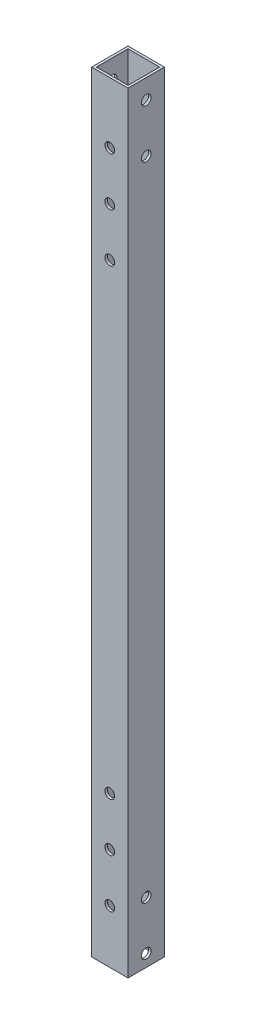
ISO-10303-21;
HEADER;
FILE_DESCRIPTION(('STEP AP214'),'2;1');
FILE_NAME('part.step','',(''),(''),'','','');
FILE_SCHEMA(('AUTOMOTIVE_DESIGN { 1 0 10303 214 1 1 1 1 }'));
ENDSEC;
DATA;
#1=APPLICATION_CONTEXT('core data for automotive mechanical design processes');
#2=APPLICATION_PROTOCOL_DEFINITION('international standard','automotive_design',2000,#1);
#3=PRODUCT_CONTEXT('',#1,'mechanical');
#4=PRODUCT('Part','Part','',(#3));
#5=PRODUCT_RELATED_PRODUCT_CATEGORY('part','',(#4));
#6=PRODUCT_DEFINITION_FORMATION('','',#4);
#7=PRODUCT_DEFINITION_CONTEXT('part definition',#1,'design');
#8=PRODUCT_DEFINITION('design','',#6,#7);
#9=PRODUCT_DEFINITION_SHAPE('','',#8);
#10=(LENGTH_UNIT() NAMED_UNIT(*) SI_UNIT(.MILLI.,.METRE.));
#11=(NAMED_UNIT(*) PLANE_ANGLE_UNIT() SI_UNIT($,.RADIAN.));
#12=(NAMED_UNIT(*) SI_UNIT($,.STERADIAN.) SOLID_ANGLE_UNIT());
#13=UNCERTAINTY_MEASURE_WITH_UNIT(LENGTH_MEASURE(1.E-05),#10,'distance_accuracy_value','');
#14=(GEOMETRIC_REPRESENTATION_CONTEXT(3) GLOBAL_UNCERTAINTY_ASSIGNED_CONTEXT((#13)) GLOBAL_UNIT_ASSIGNED_CONTEXT((#10,
#11,#12)) REPRESENTATION_CONTEXT('',''));
#15=CARTESIAN_POINT('',(0.,0.,0.));
#16=DIRECTION('',(0.,0.,1.));
#17=DIRECTION('',(1.,0.,0.));
#18=AXIS2_PLACEMENT_3D('',#15,#16,#17);
#19=CARTESIAN_POINT('',(0.,320.,0.));
#20=DIRECTION('',(0.,-1.,0.));
#21=DIRECTION('',(0.,0.,-1.));
#22=AXIS2_PLACEMENT_3D('',#19,#20,#21);
#23=PLANE('',#22);
#24=DIRECTION('',(0.,0.,-1.));
#25=VECTOR('',#24,1.);
#26=CARTESIAN_POINT('',(7.5,320.,7.5));
#27=LINE('',#26,#25);
#28=CARTESIAN_POINT('',(7.5,320.,7.5));
#29=VERTEX_POINT('',#28);
#30=CARTESIAN_POINT('',(7.5,320.,-7.5));
#31=VERTEX_POINT('',#30);
#32=EDGE_CURVE('E250',#29,#31,#27,.T.);
#33=ORIENTED_EDGE('',*,*,#32,.T.);
#34=DIRECTION('',(-1.,0.,0.));
#35=VECTOR('',#34,1.);
#36=CARTESIAN_POINT('',(-7.5,320.,-7.5));
#37=LINE('',#36,#35);
#38=CARTESIAN_POINT('',(-7.5,320.,-7.5));
#39=VERTEX_POINT('',#38);
#40=EDGE_CURVE('E123',#31,#39,#37,.T.);
#41=ORIENTED_EDGE('',*,*,#40,.T.);
#42=DIRECTION('',(0.,0.,1.));
#43=VECTOR('',#42,1.);
#44=CARTESIAN_POINT('',(-7.5,320.,7.5));
#45=LINE('',#44,#43);
#46=CARTESIAN_POINT('',(-7.5,320.,7.5));
#47=VERTEX_POINT('',#46);
#48=EDGE_CURVE('E253',#39,#47,#45,.T.);
#49=ORIENTED_EDGE('',*,*,#48,.T.);
#50=DIRECTION('',(1.,0.,0.));
#51=VECTOR('',#50,1.);
#52=CARTESIAN_POINT('',(-7.5,320.,7.5));
#53=LINE('',#52,#51);
#54=EDGE_CURVE('E255',#47,#29,#53,.T.);
#55=ORIENTED_EDGE('',*,*,#54,.T.);
#56=EDGE_LOOP('',(#33,#41,#49,#55));
#57=FACE_BOUND('',#56,.T.);
#58=DIRECTION('',(0.,0.,-1.));
#59=VECTOR('',#58,1.);
#60=CARTESIAN_POINT('',(6.5,320.,6.5));
#61=LINE('',#60,#59);
#62=CARTESIAN_POINT('',(6.5,320.,6.5));
#63=VERTEX_POINT('',#62);
#64=CARTESIAN_POINT('',(6.5,320.,-6.5));
#65=VERTEX_POINT('',#64);
#66=EDGE_CURVE('E229',#63,#65,#61,.T.);
#67=ORIENTED_EDGE('',*,*,#66,.F.);
#68=DIRECTION('',(1.,0.,0.));
#69=VECTOR('',#68,1.);
#70=CARTESIAN_POINT('',(-6.5,320.,6.5));
#71=LINE('',#70,#69);
#72=CARTESIAN_POINT('',(-6.5,320.,6.5));
#73=VERTEX_POINT('',#72);
#74=EDGE_CURVE('E236',#73,#63,#71,.T.);
#75=ORIENTED_EDGE('',*,*,#74,.F.);
#76=DIRECTION('',(0.,0.,1.));
#77=VECTOR('',#76,1.);
#78=CARTESIAN_POINT('',(-6.5,320.,6.5));
#79=LINE('',#78,#77);
#80=CARTESIAN_POINT('',(-6.5,320.,-6.5));
#81=VERTEX_POINT('',#80);
#82=EDGE_CURVE('E233',#81,#73,#79,.T.);
#83=ORIENTED_EDGE('',*,*,#82,.F.);
#84=DIRECTION('',(-1.,0.,0.));
#85=VECTOR('',#84,1.);
#86=CARTESIAN_POINT('',(-6.5,320.,-6.5));
#87=LINE('',#86,#85);
#88=EDGE_CURVE('E231',#65,#81,#87,.T.);
#89=ORIENTED_EDGE('',*,*,#88,.F.);
#90=EDGE_LOOP('',(#67,#75,#83,#89));
#91=FACE_BOUND('',#90,.T.);
#92=ADVANCED_FACE('F43',(#57,#91),#23,.F.);
#93=CARTESIAN_POINT('',(7.5,320.,7.5));
#94=DIRECTION('',(-1.,0.,0.));
#95=DIRECTION('',(0.,0.,1.));
#96=AXIS2_PLACEMENT_3D('',#93,#94,#95);
#97=PLANE('',#96);
#98=CARTESIAN_POINT('',(7.5,8.,0.));
#99=DIRECTION('',(-1.,0.,0.));
#100=DIRECTION('',(0.,0.,1.));
#101=AXIS2_PLACEMENT_3D('',#98,#99,#100);
#102=CIRCLE('',#101,2.);
#103=CARTESIAN_POINT('',(7.5,8.,2.));
#104=VERTEX_POINT('',#103);
#105=EDGE_CURVE('E160',#104,#104,#102,.T.);
#106=ORIENTED_EDGE('',*,*,#105,.T.);
#107=EDGE_LOOP('',(#106));
#108=FACE_BOUND('',#107,.T.);
#109=CARTESIAN_POINT('',(7.5,28.,0.));
#110=DIRECTION('',(-1.,0.,0.));
#111=DIRECTION('',(0.,0.,1.));
#112=AXIS2_PLACEMENT_3D('',#109,#110,#111);
#113=CIRCLE('',#112,2.);
#114=CARTESIAN_POINT('',(7.5,28.,2.));
#115=VERTEX_POINT('',#114);
#116=EDGE_CURVE('E280',#115,#115,#113,.T.);
#117=ORIENTED_EDGE('',*,*,#116,.T.);
#118=EDGE_LOOP('',(#117));
#119=FACE_BOUND('',#118,.T.);
#120=CARTESIAN_POINT('',(7.5,292.,0.));
#121=DIRECTION('',(-1.,0.,0.));
#122=DIRECTION('',(0.,0.,-1.));
#123=AXIS2_PLACEMENT_3D('',#120,#121,#122);
#124=CIRCLE('',#123,2.00000000000001);
#125=CARTESIAN_POINT('',(7.5,292.,-2.00000000000001));
#126=VERTEX_POINT('',#125);
#127=EDGE_CURVE('E286',#126,#126,#124,.T.);
#128=ORIENTED_EDGE('',*,*,#127,.T.);
#129=EDGE_LOOP('',(#128));
#130=FACE_BOUND('',#129,.T.);
#131=CARTESIAN_POINT('',(7.5,312.,0.));
#132=DIRECTION('',(-1.,0.,0.));
#133=DIRECTION('',(0.,0.,-1.));
#134=AXIS2_PLACEMENT_3D('',#131,#132,#133);
#135=CIRCLE('',#134,2.00000000000001);
#136=CARTESIAN_POINT('',(7.5,312.,-2.00000000000001));
#137=VERTEX_POINT('',#136);
#138=EDGE_CURVE('E269',#137,#137,#135,.T.);
#139=ORIENTED_EDGE('',*,*,#138,.T.);
#140=EDGE_LOOP('',(#139));
#141=FACE_BOUND('',#140,.T.);
#142=DIRECTION('',(0.,-1.,0.));
#143=VECTOR('',#142,1.);
#144=CARTESIAN_POINT('',(7.5,320.,7.5));
#145=LINE('',#144,#143);
#146=CARTESIAN_POINT('',(7.5,3.,7.5));
#147=VERTEX_POINT('',#146);
#148=EDGE_CURVE('E120',#29,#147,#145,.T.);
#149=ORIENTED_EDGE('',*,*,#148,.T.);
#150=DIRECTION('',(0.,0.,1.));
#151=VECTOR('',#150,1.);
#152=CARTESIAN_POINT('',(7.5,3.,7.5));
#153=LINE('',#152,#151);
#154=CARTESIAN_POINT('',(7.5,3.,-7.5));
#155=VERTEX_POINT('',#154);
#156=EDGE_CURVE('E58',#155,#147,#153,.T.);
#157=ORIENTED_EDGE('',*,*,#156,.F.);
#158=DIRECTION('',(0.,-1.,0.));
#159=VECTOR('',#158,1.);
#160=CARTESIAN_POINT('',(7.5,320.,-7.5));
#161=LINE('',#160,#159);
#162=EDGE_CURVE('E51',#31,#155,#161,.T.);
#163=ORIENTED_EDGE('',*,*,#162,.F.);
#164=ORIENTED_EDGE('',*,*,#32,.F.);
#165=EDGE_LOOP('',(#149,#157,#163,#164));
#166=FACE_BOUND('',#165,.T.);
#167=ADVANCED_FACE('F45',(#108,#119,#130,#141,#166),#97,.F.);
#168=CARTESIAN_POINT('',(-7.5,320.,-7.5));
#169=DIRECTION('',(0.,0.,1.));
#170=DIRECTION('',(1.,0.,0.));
#171=AXIS2_PLACEMENT_3D('',#168,#169,#170);
#172=PLANE('',#171);
#173=CARTESIAN_POINT('',(0.,295.,-7.5));
#174=DIRECTION('',(0.,0.,1.));
#175=DIRECTION('',(1.,0.,0.));
#176=AXIS2_PLACEMENT_3D('',#173,#174,#175);
#177=CIRCLE('',#176,2.00000000000001);
#178=CARTESIAN_POINT('',(1.99999999999997,295.,-7.5));
#179=VERTEX_POINT('',#178);
#180=EDGE_CURVE('E135',#179,#179,#177,.T.);
#181=ORIENTED_EDGE('',*,*,#180,.T.);
#182=EDGE_LOOP('',(#181));
#183=FACE_BOUND('',#182,.T.);
#184=CARTESIAN_POINT('',(0.,65.,-7.5));
#185=DIRECTION('',(0.,0.,1.));
#186=DIRECTION('',(-1.,0.,0.));
#187=AXIS2_PLACEMENT_3D('',#184,#185,#186);
#188=CIRCLE('',#187,2.);
#189=CARTESIAN_POINT('',(-2.,65.,-7.5));
#190=VERTEX_POINT('',#189);
#191=EDGE_CURVE('E189',#190,#190,#188,.T.);
#192=ORIENTED_EDGE('',*,*,#191,.T.);
#193=EDGE_LOOP('',(#192));
#194=FACE_BOUND('',#193,.T.);
#195=CARTESIAN_POINT('',(0.,275.,-7.5));
#196=DIRECTION('',(0.,0.,1.));
#197=DIRECTION('',(1.,0.,0.));
#198=AXIS2_PLACEMENT_3D('',#195,#196,#197);
#199=CIRCLE('',#198,2.00000000000001);
#200=CARTESIAN_POINT('',(1.99999999999998,275.,-7.5));
#201=VERTEX_POINT('',#200);
#202=EDGE_CURVE('E188',#201,#201,#199,.T.);
#203=ORIENTED_EDGE('',*,*,#202,.T.);
#204=EDGE_LOOP('',(#203));
#205=FACE_BOUND('',#204,.T.);
#206=CARTESIAN_POINT('',(0.,45.,-7.5));
#207=DIRECTION('',(0.,0.,1.));
#208=DIRECTION('',(-1.,0.,0.));
#209=AXIS2_PLACEMENT_3D('',#206,#207,#208);
#210=CIRCLE('',#209,2.);
#211=CARTESIAN_POINT('',(-2.,45.,-7.5));
#212=VERTEX_POINT('',#211);
#213=EDGE_CURVE('E212',#212,#212,#210,.T.);
#214=ORIENTED_EDGE('',*,*,#213,.T.);
#215=EDGE_LOOP('',(#214));
#216=FACE_BOUND('',#215,.T.);
#217=CARTESIAN_POINT('',(0.,25.,-7.5));
#218=DIRECTION('',(0.,0.,1.));
#219=DIRECTION('',(-1.,0.,0.));
#220=AXIS2_PLACEMENT_3D('',#217,#218,#219);
#221=CIRCLE('',#220,2.);
#222=CARTESIAN_POINT('',(-2.,25.,-7.5));
#223=VERTEX_POINT('',#222);
#224=EDGE_CURVE('E195',#223,#223,#221,.T.);
#225=ORIENTED_EDGE('',*,*,#224,.T.);
#226=EDGE_LOOP('',(#225));
#227=FACE_BOUND('',#226,.T.);
#228=CARTESIAN_POINT('',(0.,255.,-7.5));
#229=DIRECTION('',(0.,0.,1.));
#230=DIRECTION('',(1.,0.,0.));
#231=AXIS2_PLACEMENT_3D('',#228,#229,#230);
#232=CIRCLE('',#231,2.00000000000001);
#233=CARTESIAN_POINT('',(1.99999999999998,255.,-7.5));
#234=VERTEX_POINT('',#233);
#235=EDGE_CURVE('E202',#234,#234,#232,.T.);
#236=ORIENTED_EDGE('',*,*,#235,.T.);
#237=EDGE_LOOP('',(#236));
#238=FACE_BOUND('',#237,.T.);
#239=ORIENTED_EDGE('',*,*,#162,.T.);
#240=DIRECTION('',(1.,0.,0.));
#241=VECTOR('',#240,1.);
#242=CARTESIAN_POINT('',(-12.5,3.,-7.5));
#243=LINE('',#242,#241);
#244=CARTESIAN_POINT('',(-7.5,3.,-7.5));
#245=VERTEX_POINT('',#244);
#246=EDGE_CURVE('E105',#245,#155,#243,.T.);
#247=ORIENTED_EDGE('',*,*,#246,.F.);
#248=DIRECTION('',(0.,-1.,0.));
#249=VECTOR('',#248,1.);
#250=CARTESIAN_POINT('',(-7.5,320.,-7.5));
#251=LINE('',#250,#249);
#252=EDGE_CURVE('E125',#39,#245,#251,.T.);
#253=ORIENTED_EDGE('',*,*,#252,.F.);
#254=ORIENTED_EDGE('',*,*,#40,.F.);
#255=EDGE_LOOP('',(#239,#247,#253,#254));
#256=FACE_BOUND('',#255,.T.);
#257=ADVANCED_FACE('F122',(#183,#194,#205,#216,#227,#238,#256),#172,.F.);
#258=CARTESIAN_POINT('',(-7.5,320.,7.5));
#259=DIRECTION('',(1.,0.,0.));
#260=DIRECTION('',(0.,0.,-1.));
#261=AXIS2_PLACEMENT_3D('',#258,#259,#260);
#262=PLANE('',#261);
#263=CARTESIAN_POINT('',(-7.5,8.,0.));
#264=DIRECTION('',(-1.,0.,0.));
#265=DIRECTION('',(0.,0.,1.));
#266=AXIS2_PLACEMENT_3D('',#263,#264,#265);
#267=CIRCLE('',#266,2.);
#268=CARTESIAN_POINT('',(-7.5,8.,2.));
#269=VERTEX_POINT('',#268);
#270=EDGE_CURVE('E277',#269,#269,#267,.T.);
#271=ORIENTED_EDGE('',*,*,#270,.F.);
#272=EDGE_LOOP('',(#271));
#273=FACE_BOUND('',#272,.T.);
#274=CARTESIAN_POINT('',(-7.5,28.,0.));
#275=DIRECTION('',(-1.,0.,0.));
#276=DIRECTION('',(0.,0.,1.));
#277=AXIS2_PLACEMENT_3D('',#274,#275,#276);
#278=CIRCLE('',#277,2.);
#279=CARTESIAN_POINT('',(-7.5,28.,2.));
#280=VERTEX_POINT('',#279);
#281=EDGE_CURVE('E283',#280,#280,#278,.T.);
#282=ORIENTED_EDGE('',*,*,#281,.F.);
#283=EDGE_LOOP('',(#282));
#284=FACE_BOUND('',#283,.T.);
#285=CARTESIAN_POINT('',(-7.5,292.,0.));
#286=DIRECTION('',(-1.,0.,0.));
#287=DIRECTION('',(0.,0.,-1.));
#288=AXIS2_PLACEMENT_3D('',#285,#286,#287);
#289=CIRCLE('',#288,2.00000000000001);
#290=CARTESIAN_POINT('',(-7.5,292.,-2.00000000000001));
#291=VERTEX_POINT('',#290);
#292=EDGE_CURVE('E289',#291,#291,#289,.T.);
#293=ORIENTED_EDGE('',*,*,#292,.F.);
#294=EDGE_LOOP('',(#293));
#295=FACE_BOUND('',#294,.T.);
#296=CARTESIAN_POINT('',(-7.5,312.,0.));
#297=DIRECTION('',(-1.,0.,0.));
#298=DIRECTION('',(0.,0.,-1.));
#299=AXIS2_PLACEMENT_3D('',#296,#297,#298);
#300=CIRCLE('',#299,2.00000000000001);
#301=CARTESIAN_POINT('',(-7.5,312.,-2.00000000000001));
#302=VERTEX_POINT('',#301);
#303=EDGE_CURVE('E265',#302,#302,#300,.T.);
#304=ORIENTED_EDGE('',*,*,#303,.F.);
#305=EDGE_LOOP('',(#304));
#306=FACE_BOUND('',#305,.T.);
#307=ORIENTED_EDGE('',*,*,#252,.T.);
#308=DIRECTION('',(0.,0.,1.));
#309=VECTOR('',#308,1.);
#310=CARTESIAN_POINT('',(-7.5,3.,7.5));
#311=LINE('',#310,#309);
#312=CARTESIAN_POINT('',(-7.5,3.,7.5));
#313=VERTEX_POINT('',#312);
#314=EDGE_CURVE('E108',#245,#313,#311,.T.);
#315=ORIENTED_EDGE('',*,*,#314,.T.);
#316=DIRECTION('',(0.,-1.,0.));
#317=VECTOR('',#316,1.);
#318=CARTESIAN_POINT('',(-7.5,320.,7.5));
#319=LINE('',#318,#317);
#320=EDGE_CURVE('E127',#47,#313,#319,.T.);
#321=ORIENTED_EDGE('',*,*,#320,.F.);
#322=ORIENTED_EDGE('',*,*,#48,.F.);
#323=EDGE_LOOP('',(#307,#315,#321,#322));
#324=FACE_BOUND('',#323,.T.);
#325=ADVANCED_FACE('F264',(#273,#284,#295,#306,#324),#262,.F.);
#326=CARTESIAN_POINT('',(-7.5,320.,7.5));
#327=DIRECTION('',(0.,0.,-1.));
#328=DIRECTION('',(-1.,0.,0.));
#329=AXIS2_PLACEMENT_3D('',#326,#327,#328);
#330=PLANE('',#329);
#331=CARTESIAN_POINT('',(0.,295.,7.5));
#332=DIRECTION('',(0.,0.,1.));
#333=DIRECTION('',(1.,0.,0.));
#334=AXIS2_PLACEMENT_3D('',#331,#332,#333);
#335=CIRCLE('',#334,2.00000000000001);
#336=CARTESIAN_POINT('',(1.99999999999997,295.,7.5));
#337=VERTEX_POINT('',#336);
#338=EDGE_CURVE('E185',#337,#337,#335,.T.);
#339=ORIENTED_EDGE('',*,*,#338,.F.);
#340=EDGE_LOOP('',(#339));
#341=FACE_BOUND('',#340,.T.);
#342=CARTESIAN_POINT('',(0.,65.,7.5));
#343=DIRECTION('',(0.,0.,1.));
#344=DIRECTION('',(-1.,0.,0.));
#345=AXIS2_PLACEMENT_3D('',#342,#343,#344);
#346=CIRCLE('',#345,2.);
#347=CARTESIAN_POINT('',(-2.,65.,7.5));
#348=VERTEX_POINT('',#347);
#349=EDGE_CURVE('E174',#348,#348,#346,.T.);
#350=ORIENTED_EDGE('',*,*,#349,.F.);
#351=EDGE_LOOP('',(#350));
#352=FACE_BOUND('',#351,.T.);
#353=CARTESIAN_POINT('',(0.,275.,7.5));
#354=DIRECTION('',(0.,0.,1.));
#355=DIRECTION('',(1.,0.,0.));
#356=AXIS2_PLACEMENT_3D('',#353,#354,#355);
#357=CIRCLE('',#356,2.00000000000001);
#358=CARTESIAN_POINT('',(1.99999999999998,275.,7.5));
#359=VERTEX_POINT('',#358);
#360=EDGE_CURVE('E209',#359,#359,#357,.T.);
#361=ORIENTED_EDGE('',*,*,#360,.F.);
#362=EDGE_LOOP('',(#361));
#363=FACE_BOUND('',#362,.T.);
#364=CARTESIAN_POINT('',(0.,45.,7.5));
#365=DIRECTION('',(0.,0.,1.));
#366=DIRECTION('',(-1.,0.,0.));
#367=AXIS2_PLACEMENT_3D('',#364,#365,#366);
#368=CIRCLE('',#367,2.);
#369=CARTESIAN_POINT('',(-2.,45.,7.5));
#370=VERTEX_POINT('',#369);
#371=EDGE_CURVE('E198',#370,#370,#368,.T.);
#372=ORIENTED_EDGE('',*,*,#371,.F.);
#373=EDGE_LOOP('',(#372));
#374=FACE_BOUND('',#373,.T.);
#375=CARTESIAN_POINT('',(0.,25.,7.5));
#376=DIRECTION('',(0.,0.,1.));
#377=DIRECTION('',(-1.,0.,0.));
#378=AXIS2_PLACEMENT_3D('',#375,#376,#377);
#379=CIRCLE('',#378,2.);
#380=CARTESIAN_POINT('',(-2.,25.,7.5));
#381=VERTEX_POINT('',#380);
#382=EDGE_CURVE('E199',#381,#381,#379,.T.);
#383=ORIENTED_EDGE('',*,*,#382,.F.);
#384=EDGE_LOOP('',(#383));
#385=FACE_BOUND('',#384,.T.);
#386=CARTESIAN_POINT('',(0.,255.,7.5));
#387=DIRECTION('',(0.,0.,1.));
#388=DIRECTION('',(1.,0.,0.));
#389=AXIS2_PLACEMENT_3D('',#386,#387,#388);
#390=CIRCLE('',#389,2.00000000000001);
#391=CARTESIAN_POINT('',(1.99999999999998,255.,7.5));
#392=VERTEX_POINT('',#391);
#393=EDGE_CURVE('E192',#392,#392,#390,.T.);
#394=ORIENTED_EDGE('',*,*,#393,.F.);
#395=EDGE_LOOP('',(#394));
#396=FACE_BOUND('',#395,.T.);
#397=ORIENTED_EDGE('',*,*,#320,.T.);
#398=DIRECTION('',(1.,0.,0.));
#399=VECTOR('',#398,1.);
#400=CARTESIAN_POINT('',(-12.5,3.,7.5));
#401=LINE('',#400,#399);
#402=EDGE_CURVE('E113',#313,#147,#401,.T.);
#403=ORIENTED_EDGE('',*,*,#402,.T.);
#404=ORIENTED_EDGE('',*,*,#148,.F.);
#405=ORIENTED_EDGE('',*,*,#54,.F.);
#406=EDGE_LOOP('',(#397,#403,#404,#405));
#407=FACE_BOUND('',#406,.T.);
#408=ADVANCED_FACE('F261',(#341,#352,#363,#374,#385,#396,#407),#330,.F.);
#409=CARTESIAN_POINT('',(6.5,320.,6.5));
#410=DIRECTION('',(-1.,0.,0.));
#411=DIRECTION('',(0.,0.,1.));
#412=AXIS2_PLACEMENT_3D('',#409,#410,#411);
#413=PLANE('',#412);
#414=DIRECTION('',(0.,0.,-1.));
#415=VECTOR('',#414,1.);
#416=CARTESIAN_POINT('',(6.5,3.,6.5));
#417=LINE('',#416,#415);
#418=CARTESIAN_POINT('',(6.5,3.,6.5));
#419=VERTEX_POINT('',#418);
#420=CARTESIAN_POINT('',(6.5,3.,-6.5));
#421=VERTEX_POINT('',#420);
#422=EDGE_CURVE('E266',#419,#421,#417,.T.);
#423=ORIENTED_EDGE('',*,*,#422,.F.);
#424=DIRECTION('',(0.,-1.,0.));
#425=VECTOR('',#424,1.);
#426=CARTESIAN_POINT('',(6.5,320.,6.5));
#427=LINE('',#426,#425);
#428=EDGE_CURVE('E238',#63,#419,#427,.T.);
#429=ORIENTED_EDGE('',*,*,#428,.F.);
#430=ORIENTED_EDGE('',*,*,#66,.T.);
#431=DIRECTION('',(0.,-1.,0.));
#432=VECTOR('',#431,1.);
#433=CARTESIAN_POINT('',(6.5,320.,-6.5));
#434=LINE('',#433,#432);
#435=EDGE_CURVE('E247',#65,#421,#434,.T.);
#436=ORIENTED_EDGE('',*,*,#435,.T.);
#437=EDGE_LOOP('',(#423,#429,#430,#436));
#438=FACE_BOUND('',#437,.T.);
#439=CARTESIAN_POINT('',(6.5,8.,0.));
#440=DIRECTION('',(-1.,0.,0.));
#441=DIRECTION('',(0.,0.,1.));
#442=AXIS2_PLACEMENT_3D('',#439,#440,#441);
#443=CIRCLE('',#442,2.);
#444=CARTESIAN_POINT('',(6.5,8.,2.));
#445=VERTEX_POINT('',#444);
#446=EDGE_CURVE('E170',#445,#445,#443,.T.);
#447=ORIENTED_EDGE('',*,*,#446,.F.);
#448=EDGE_LOOP('',(#447));
#449=FACE_BOUND('',#448,.T.);
#450=CARTESIAN_POINT('',(6.5,28.,0.));
#451=DIRECTION('',(-1.,0.,0.));
#452=DIRECTION('',(0.,0.,1.));
#453=AXIS2_PLACEMENT_3D('',#450,#451,#452);
#454=CIRCLE('',#453,2.);
#455=CARTESIAN_POINT('',(6.5,28.,2.));
#456=VERTEX_POINT('',#455);
#457=EDGE_CURVE('E167',#456,#456,#454,.T.);
#458=ORIENTED_EDGE('',*,*,#457,.F.);
#459=EDGE_LOOP('',(#458));
#460=FACE_BOUND('',#459,.T.);
#461=CARTESIAN_POINT('',(6.5,292.,0.));
#462=DIRECTION('',(-1.,0.,0.));
#463=DIRECTION('',(0.,0.,1.));
#464=AXIS2_PLACEMENT_3D('',#461,#462,#463);
#465=CIRCLE('',#464,2.00000000000001);
#466=CARTESIAN_POINT('',(6.5,292.,2.00000000000001));
#467=VERTEX_POINT('',#466);
#468=EDGE_CURVE('E164',#467,#467,#465,.T.);
#469=ORIENTED_EDGE('',*,*,#468,.F.);
#470=EDGE_LOOP('',(#469));
#471=FACE_BOUND('',#470,.T.);
#472=CARTESIAN_POINT('',(6.5,312.,0.));
#473=DIRECTION('',(-1.,0.,0.));
#474=DIRECTION('',(0.,0.,1.));
#475=AXIS2_PLACEMENT_3D('',#472,#473,#474);
#476=CIRCLE('',#475,2.00000000000001);
#477=CARTESIAN_POINT('',(6.5,312.,2.00000000000001));
#478=VERTEX_POINT('',#477);
#479=EDGE_CURVE('E159',#478,#478,#476,.T.);
#480=ORIENTED_EDGE('',*,*,#479,.F.);
#481=EDGE_LOOP('',(#480));
#482=FACE_BOUND('',#481,.T.);
#483=ADVANCED_FACE('F299',(#438,#449,#460,#471,#482),#413,.T.);
#484=CARTESIAN_POINT('',(-6.5,320.,-6.5));
#485=DIRECTION('',(0.,0.,1.));
#486=DIRECTION('',(1.,0.,0.));
#487=AXIS2_PLACEMENT_3D('',#484,#485,#486);
#488=PLANE('',#487);
#489=DIRECTION('',(-1.,0.,0.));
#490=VECTOR('',#489,1.);
#491=CARTESIAN_POINT('',(-6.5,3.,-6.5));
#492=LINE('',#491,#490);
#493=CARTESIAN_POINT('',(-6.5,3.,-6.5));
#494=VERTEX_POINT('',#493);
#495=EDGE_CURVE('E271',#421,#494,#492,.T.);
#496=ORIENTED_EDGE('',*,*,#495,.F.);
#497=ORIENTED_EDGE('',*,*,#435,.F.);
#498=ORIENTED_EDGE('',*,*,#88,.T.);
#499=DIRECTION('',(0.,-1.,0.));
#500=VECTOR('',#499,1.);
#501=CARTESIAN_POINT('',(-6.5,320.,-6.5));
#502=LINE('',#501,#500);
#503=EDGE_CURVE('E244',#81,#494,#502,.T.);
#504=ORIENTED_EDGE('',*,*,#503,.T.);
#505=EDGE_LOOP('',(#496,#497,#498,#504));
#506=FACE_BOUND('',#505,.T.);
#507=CARTESIAN_POINT('',(0.,295.,-6.5));
#508=DIRECTION('',(0.,0.,1.));
#509=DIRECTION('',(1.,0.,0.));
#510=AXIS2_PLACEMENT_3D('',#507,#508,#509);
#511=CIRCLE('',#510,2.00000000000001);
#512=CARTESIAN_POINT('',(1.99999999999997,295.,-6.5));
#513=VERTEX_POINT('',#512);
#514=EDGE_CURVE('E155',#513,#513,#511,.T.);
#515=ORIENTED_EDGE('',*,*,#514,.F.);
#516=EDGE_LOOP('',(#515));
#517=FACE_BOUND('',#516,.T.);
#518=CARTESIAN_POINT('',(0.,65.,-6.5));
#519=DIRECTION('',(0.,0.,1.));
#520=DIRECTION('',(1.,0.,0.));
#521=AXIS2_PLACEMENT_3D('',#518,#519,#520);
#522=CIRCLE('',#521,2.);
#523=CARTESIAN_POINT('',(2.,65.,-6.5));
#524=VERTEX_POINT('',#523);
#525=EDGE_CURVE('E151',#524,#524,#522,.T.);
#526=ORIENTED_EDGE('',*,*,#525,.F.);
#527=EDGE_LOOP('',(#526));
#528=FACE_BOUND('',#527,.T.);
#529=CARTESIAN_POINT('',(0.,275.,-6.5));
#530=DIRECTION('',(0.,0.,1.));
#531=DIRECTION('',(1.,0.,0.));
#532=AXIS2_PLACEMENT_3D('',#529,#530,#531);
#533=CIRCLE('',#532,2.00000000000001);
#534=CARTESIAN_POINT('',(1.99999999999998,275.,-6.5));
#535=VERTEX_POINT('',#534);
#536=EDGE_CURVE('E147',#535,#535,#533,.T.);
#537=ORIENTED_EDGE('',*,*,#536,.F.);
#538=EDGE_LOOP('',(#537));
#539=FACE_BOUND('',#538,.T.);
#540=CARTESIAN_POINT('',(0.,45.,-6.5));
#541=DIRECTION('',(0.,0.,1.));
#542=DIRECTION('',(1.,0.,0.));
#543=AXIS2_PLACEMENT_3D('',#540,#541,#542);
#544=CIRCLE('',#543,2.);
#545=CARTESIAN_POINT('',(2.,45.,-6.5));
#546=VERTEX_POINT('',#545);
#547=EDGE_CURVE('E143',#546,#546,#544,.T.);
#548=ORIENTED_EDGE('',*,*,#547,.F.);
#549=EDGE_LOOP('',(#548));
#550=FACE_BOUND('',#549,.T.);
#551=CARTESIAN_POINT('',(0.,25.,-6.5));
#552=DIRECTION('',(0.,0.,1.));
#553=DIRECTION('',(1.,0.,0.));
#554=AXIS2_PLACEMENT_3D('',#551,#552,#553);
#555=CIRCLE('',#554,2.);
#556=CARTESIAN_POINT('',(2.,25.,-6.5));
#557=VERTEX_POINT('',#556);
#558=EDGE_CURVE('E139',#557,#557,#555,.T.);
#559=ORIENTED_EDGE('',*,*,#558,.F.);
#560=EDGE_LOOP('',(#559));
#561=FACE_BOUND('',#560,.T.);
#562=CARTESIAN_POINT('',(0.,255.,-6.5));
#563=DIRECTION('',(0.,0.,1.));
#564=DIRECTION('',(1.,0.,0.));
#565=AXIS2_PLACEMENT_3D('',#562,#563,#564);
#566=CIRCLE('',#565,2.00000000000001);
#567=CARTESIAN_POINT('',(1.99999999999998,255.,-6.5));
#568=VERTEX_POINT('',#567);
#569=EDGE_CURVE('E134',#568,#568,#566,.T.);
#570=ORIENTED_EDGE('',*,*,#569,.F.);
#571=EDGE_LOOP('',(#570));
#572=FACE_BOUND('',#571,.T.);
#573=ADVANCED_FACE('F301',(#506,#517,#528,#539,#550,#561,#572),#488,.T.);
#574=CARTESIAN_POINT('',(-6.5,320.,6.5));
#575=DIRECTION('',(1.,0.,0.));
#576=DIRECTION('',(0.,0.,-1.));
#577=AXIS2_PLACEMENT_3D('',#574,#575,#576);
#578=PLANE('',#577);
#579=DIRECTION('',(0.,0.,1.));
#580=VECTOR('',#579,1.);
#581=CARTESIAN_POINT('',(-6.5,3.,6.5));
#582=LINE('',#581,#580);
#583=CARTESIAN_POINT('',(-6.5,3.,6.5));
#584=VERTEX_POINT('',#583);
#585=EDGE_CURVE('E65',#494,#584,#582,.T.);
#586=ORIENTED_EDGE('',*,*,#585,.F.);
#587=ORIENTED_EDGE('',*,*,#503,.F.);
#588=ORIENTED_EDGE('',*,*,#82,.T.);
#589=DIRECTION('',(0.,-1.,0.));
#590=VECTOR('',#589,1.);
#591=CARTESIAN_POINT('',(-6.5,320.,6.5));
#592=LINE('',#591,#590);
#593=EDGE_CURVE('E241',#73,#584,#592,.T.);
#594=ORIENTED_EDGE('',*,*,#593,.T.);
#595=EDGE_LOOP('',(#586,#587,#588,#594));
#596=FACE_BOUND('',#595,.T.);
#597=CARTESIAN_POINT('',(-6.5,8.,0.));
#598=DIRECTION('',(1.,0.,0.));
#599=DIRECTION('',(0.,0.,-1.));
#600=AXIS2_PLACEMENT_3D('',#597,#598,#599);
#601=CIRCLE('',#600,2.);
#602=CARTESIAN_POINT('',(-6.5,8.,-2.));
#603=VERTEX_POINT('',#602);
#604=EDGE_CURVE('E168',#603,#603,#601,.T.);
#605=ORIENTED_EDGE('',*,*,#604,.F.);
#606=EDGE_LOOP('',(#605));
#607=FACE_BOUND('',#606,.T.);
#608=CARTESIAN_POINT('',(-6.5,28.,0.));
#609=DIRECTION('',(1.,0.,0.));
#610=DIRECTION('',(0.,0.,-1.));
#611=AXIS2_PLACEMENT_3D('',#608,#609,#610);
#612=CIRCLE('',#611,2.);
#613=CARTESIAN_POINT('',(-6.5,28.,-2.));
#614=VERTEX_POINT('',#613);
#615=EDGE_CURVE('E165',#614,#614,#612,.T.);
#616=ORIENTED_EDGE('',*,*,#615,.F.);
#617=EDGE_LOOP('',(#616));
#618=FACE_BOUND('',#617,.T.);
#619=CARTESIAN_POINT('',(-6.5,292.,0.));
#620=DIRECTION('',(1.,0.,0.));
#621=DIRECTION('',(0.,0.,-1.));
#622=AXIS2_PLACEMENT_3D('',#619,#620,#621);
#623=CIRCLE('',#622,2.00000000000001);
#624=CARTESIAN_POINT('',(-6.5,292.,-2.00000000000001));
#625=VERTEX_POINT('',#624);
#626=EDGE_CURVE('E161',#625,#625,#623,.T.);
#627=ORIENTED_EDGE('',*,*,#626,.F.);
#628=EDGE_LOOP('',(#627));
#629=FACE_BOUND('',#628,.T.);
#630=CARTESIAN_POINT('',(-6.5,312.,0.));
#631=DIRECTION('',(1.,0.,0.));
#632=DIRECTION('',(0.,0.,-1.));
#633=AXIS2_PLACEMENT_3D('',#630,#631,#632);
#634=CIRCLE('',#633,2.00000000000001);
#635=CARTESIAN_POINT('',(-6.5,312.,-2.00000000000001));
#636=VERTEX_POINT('',#635);
#637=EDGE_CURVE('E156',#636,#636,#634,.T.);
#638=ORIENTED_EDGE('',*,*,#637,.F.);
#639=EDGE_LOOP('',(#638));
#640=FACE_BOUND('',#639,.T.);
#641=ADVANCED_FACE('F308',(#596,#607,#618,#629,#640),#578,.T.);
#642=CARTESIAN_POINT('',(-6.5,320.,6.5));
#643=DIRECTION('',(0.,0.,-1.));
#644=DIRECTION('',(-1.,0.,0.));
#645=AXIS2_PLACEMENT_3D('',#642,#643,#644);
#646=PLANE('',#645);
#647=DIRECTION('',(1.,0.,0.));
#648=VECTOR('',#647,1.);
#649=CARTESIAN_POINT('',(-6.5,3.,6.5));
#650=LINE('',#649,#648);
#651=EDGE_CURVE('E11',#584,#419,#650,.T.);
#652=ORIENTED_EDGE('',*,*,#651,.F.);
#653=ORIENTED_EDGE('',*,*,#593,.F.);
#654=ORIENTED_EDGE('',*,*,#74,.T.);
#655=ORIENTED_EDGE('',*,*,#428,.T.);
#656=EDGE_LOOP('',(#652,#653,#654,#655));
#657=FACE_BOUND('',#656,.T.);
#658=CARTESIAN_POINT('',(0.,295.,6.5));
#659=DIRECTION('',(0.,0.,-1.));
#660=DIRECTION('',(-1.,0.,0.));
#661=AXIS2_PLACEMENT_3D('',#658,#659,#660);
#662=CIRCLE('',#661,2.00000000000001);
#663=CARTESIAN_POINT('',(-2.00000000000004,295.,6.5));
#664=VERTEX_POINT('',#663);
#665=EDGE_CURVE('E152',#664,#664,#662,.T.);
#666=ORIENTED_EDGE('',*,*,#665,.F.);
#667=EDGE_LOOP('',(#666));
#668=FACE_BOUND('',#667,.T.);
#669=CARTESIAN_POINT('',(0.,65.,6.5));
#670=DIRECTION('',(0.,0.,-1.));
#671=DIRECTION('',(-1.,0.,0.));
#672=AXIS2_PLACEMENT_3D('',#669,#670,#671);
#673=CIRCLE('',#672,2.);
#674=CARTESIAN_POINT('',(-2.,65.,6.5));
#675=VERTEX_POINT('',#674);
#676=EDGE_CURVE('E148',#675,#675,#673,.T.);
#677=ORIENTED_EDGE('',*,*,#676,.F.);
#678=EDGE_LOOP('',(#677));
#679=FACE_BOUND('',#678,.T.);
#680=CARTESIAN_POINT('',(0.,275.,6.5));
#681=DIRECTION('',(0.,0.,-1.));
#682=DIRECTION('',(-1.,0.,0.));
#683=AXIS2_PLACEMENT_3D('',#680,#681,#682);
#684=CIRCLE('',#683,2.00000000000001);
#685=CARTESIAN_POINT('',(-2.00000000000003,275.,6.5));
#686=VERTEX_POINT('',#685);
#687=EDGE_CURVE('E144',#686,#686,#684,.T.);
#688=ORIENTED_EDGE('',*,*,#687,.F.);
#689=EDGE_LOOP('',(#688));
#690=FACE_BOUND('',#689,.T.);
#691=CARTESIAN_POINT('',(0.,45.,6.5));
#692=DIRECTION('',(0.,0.,-1.));
#693=DIRECTION('',(-1.,0.,0.));
#694=AXIS2_PLACEMENT_3D('',#691,#692,#693);
#695=CIRCLE('',#694,2.);
#696=CARTESIAN_POINT('',(-2.,45.,6.5));
#697=VERTEX_POINT('',#696);
#698=EDGE_CURVE('E140',#697,#697,#695,.T.);
#699=ORIENTED_EDGE('',*,*,#698,.F.);
#700=EDGE_LOOP('',(#699));
#701=FACE_BOUND('',#700,.T.);
#702=CARTESIAN_POINT('',(0.,25.,6.5));
#703=DIRECTION('',(0.,0.,-1.));
#704=DIRECTION('',(-1.,0.,0.));
#705=AXIS2_PLACEMENT_3D('',#702,#703,#704);
#706=CIRCLE('',#705,2.);
#707=CARTESIAN_POINT('',(-2.,25.,6.5));
#708=VERTEX_POINT('',#707);
#709=EDGE_CURVE('E136',#708,#708,#706,.T.);
#710=ORIENTED_EDGE('',*,*,#709,.F.);
#711=EDGE_LOOP('',(#710));
#712=FACE_BOUND('',#711,.T.);
#713=CARTESIAN_POINT('',(0.,255.,6.5));
#714=DIRECTION('',(0.,0.,-1.));
#715=DIRECTION('',(-1.,0.,0.));
#716=AXIS2_PLACEMENT_3D('',#713,#714,#715);
#717=CIRCLE('',#716,2.00000000000001);
#718=CARTESIAN_POINT('',(-2.00000000000003,255.,6.5));
#719=VERTEX_POINT('',#718);
#720=EDGE_CURVE('E131',#719,#719,#717,.T.);
#721=ORIENTED_EDGE('',*,*,#720,.F.);
#722=EDGE_LOOP('',(#721));
#723=FACE_BOUND('',#722,.T.);
#724=ADVANCED_FACE('F363',(#657,#668,#679,#690,#701,#712,#723),#646,.T.);
#725=CARTESIAN_POINT('',(0.,255.,-7.5));
#726=DIRECTION('',(0.,0.,1.));
#727=DIRECTION('',(1.,0.,0.));
#728=AXIS2_PLACEMENT_3D('',#725,#726,#727);
#729=CYLINDRICAL_SURFACE('',#728,2.00000000000001);
#730=ORIENTED_EDGE('',*,*,#720,.T.);
#731=EDGE_LOOP('',(#730));
#732=FACE_BOUND('',#731,.T.);
#733=ORIENTED_EDGE('',*,*,#393,.T.);
#734=EDGE_LOOP('',(#733));
#735=FACE_BOUND('',#734,.T.);
#736=ADVANCED_FACE('F349',(#732,#735),#729,.F.);
#737=CARTESIAN_POINT('',(0.,25.,-7.5));
#738=DIRECTION('',(0.,0.,1.));
#739=DIRECTION('',(1.,0.,0.));
#740=AXIS2_PLACEMENT_3D('',#737,#738,#739);
#741=CYLINDRICAL_SURFACE('',#740,2.);
#742=ORIENTED_EDGE('',*,*,#709,.T.);
#743=EDGE_LOOP('',(#742));
#744=FACE_BOUND('',#743,.T.);
#745=ORIENTED_EDGE('',*,*,#382,.T.);
#746=EDGE_LOOP('',(#745));
#747=FACE_BOUND('',#746,.T.);
#748=ADVANCED_FACE('F357',(#744,#747),#741,.F.);
#749=CARTESIAN_POINT('',(0.,45.,-7.5));
#750=DIRECTION('',(0.,0.,1.));
#751=DIRECTION('',(1.,0.,0.));
#752=AXIS2_PLACEMENT_3D('',#749,#750,#751);
#753=CYLINDRICAL_SURFACE('',#752,2.);
#754=ORIENTED_EDGE('',*,*,#698,.T.);
#755=EDGE_LOOP('',(#754));
#756=FACE_BOUND('',#755,.T.);
#757=ORIENTED_EDGE('',*,*,#371,.T.);
#758=EDGE_LOOP('',(#757));
#759=FACE_BOUND('',#758,.T.);
#760=ADVANCED_FACE('F368',(#756,#759),#753,.F.);
#761=CARTESIAN_POINT('',(0.,275.,-7.5));
#762=DIRECTION('',(0.,0.,1.));
#763=DIRECTION('',(1.,0.,0.));
#764=AXIS2_PLACEMENT_3D('',#761,#762,#763);
#765=CYLINDRICAL_SURFACE('',#764,2.00000000000001);
#766=ORIENTED_EDGE('',*,*,#687,.T.);
#767=EDGE_LOOP('',(#766));
#768=FACE_BOUND('',#767,.T.);
#769=ORIENTED_EDGE('',*,*,#360,.T.);
#770=EDGE_LOOP('',(#769));
#771=FACE_BOUND('',#770,.T.);
#772=ADVANCED_FACE('F387',(#768,#771),#765,.F.);
#773=CARTESIAN_POINT('',(0.,65.,-7.5));
#774=DIRECTION('',(0.,0.,1.));
#775=DIRECTION('',(1.,0.,0.));
#776=AXIS2_PLACEMENT_3D('',#773,#774,#775);
#777=CYLINDRICAL_SURFACE('',#776,2.);
#778=ORIENTED_EDGE('',*,*,#676,.T.);
#779=EDGE_LOOP('',(#778));
#780=FACE_BOUND('',#779,.T.);
#781=ORIENTED_EDGE('',*,*,#349,.T.);
#782=EDGE_LOOP('',(#781));
#783=FACE_BOUND('',#782,.T.);
#784=ADVANCED_FACE('F358',(#780,#783),#777,.F.);
#785=CARTESIAN_POINT('',(0.,295.,-7.5));
#786=DIRECTION('',(0.,0.,1.));
#787=DIRECTION('',(1.,0.,0.));
#788=AXIS2_PLACEMENT_3D('',#785,#786,#787);
#789=CYLINDRICAL_SURFACE('',#788,2.00000000000001);
#790=ORIENTED_EDGE('',*,*,#665,.T.);
#791=EDGE_LOOP('',(#790));
#792=FACE_BOUND('',#791,.T.);
#793=ORIENTED_EDGE('',*,*,#338,.T.);
#794=EDGE_LOOP('',(#793));
#795=FACE_BOUND('',#794,.T.);
#796=ADVANCED_FACE('F346',(#792,#795),#789,.F.);
#797=ORIENTED_EDGE('',*,*,#569,.T.);
#798=EDGE_LOOP('',(#797));
#799=FACE_BOUND('',#798,.T.);
#800=ORIENTED_EDGE('',*,*,#235,.F.);
#801=EDGE_LOOP('',(#800));
#802=FACE_BOUND('',#801,.T.);
#803=ADVANCED_FACE('F343',(#799,#802),#729,.F.);
#804=ORIENTED_EDGE('',*,*,#558,.T.);
#805=EDGE_LOOP('',(#804));
#806=FACE_BOUND('',#805,.T.);
#807=ORIENTED_EDGE('',*,*,#224,.F.);
#808=EDGE_LOOP('',(#807));
#809=FACE_BOUND('',#808,.T.);
#810=ADVANCED_FACE('F345',(#806,#809),#741,.F.);
#811=ORIENTED_EDGE('',*,*,#547,.T.);
#812=EDGE_LOOP('',(#811));
#813=FACE_BOUND('',#812,.T.);
#814=ORIENTED_EDGE('',*,*,#213,.F.);
#815=EDGE_LOOP('',(#814));
#816=FACE_BOUND('',#815,.T.);
#817=ADVANCED_FACE('F354',(#813,#816),#753,.F.);
#818=ORIENTED_EDGE('',*,*,#536,.T.);
#819=EDGE_LOOP('',(#818));
#820=FACE_BOUND('',#819,.T.);
#821=ORIENTED_EDGE('',*,*,#202,.F.);
#822=EDGE_LOOP('',(#821));
#823=FACE_BOUND('',#822,.T.);
#824=ADVANCED_FACE('F391',(#820,#823),#765,.F.);
#825=ORIENTED_EDGE('',*,*,#525,.T.);
#826=EDGE_LOOP('',(#825));
#827=FACE_BOUND('',#826,.T.);
#828=ORIENTED_EDGE('',*,*,#191,.F.);
#829=EDGE_LOOP('',(#828));
#830=FACE_BOUND('',#829,.T.);
#831=ADVANCED_FACE('F397',(#827,#830),#777,.F.);
#832=ORIENTED_EDGE('',*,*,#514,.T.);
#833=EDGE_LOOP('',(#832));
#834=FACE_BOUND('',#833,.T.);
#835=ORIENTED_EDGE('',*,*,#180,.F.);
#836=EDGE_LOOP('',(#835));
#837=FACE_BOUND('',#836,.T.);
#838=ADVANCED_FACE('F361',(#834,#837),#789,.F.);
#839=CARTESIAN_POINT('',(7.5,312.,0.));
#840=DIRECTION('',(-1.,0.,0.));
#841=DIRECTION('',(0.,0.,1.));
#842=AXIS2_PLACEMENT_3D('',#839,#840,#841);
#843=CYLINDRICAL_SURFACE('',#842,2.00000000000001);
#844=ORIENTED_EDGE('',*,*,#637,.T.);
#845=EDGE_LOOP('',(#844));
#846=FACE_BOUND('',#845,.T.);
#847=ORIENTED_EDGE('',*,*,#303,.T.);
#848=EDGE_LOOP('',(#847));
#849=FACE_BOUND('',#848,.T.);
#850=ADVANCED_FACE('F546',(#846,#849),#843,.F.);
#851=CARTESIAN_POINT('',(7.5,292.,0.));
#852=DIRECTION('',(-1.,0.,0.));
#853=DIRECTION('',(0.,0.,1.));
#854=AXIS2_PLACEMENT_3D('',#851,#852,#853);
#855=CYLINDRICAL_SURFACE('',#854,2.00000000000001);
#856=ORIENTED_EDGE('',*,*,#626,.T.);
#857=EDGE_LOOP('',(#856));
#858=FACE_BOUND('',#857,.T.);
#859=ORIENTED_EDGE('',*,*,#292,.T.);
#860=EDGE_LOOP('',(#859));
#861=FACE_BOUND('',#860,.T.);
#862=ADVANCED_FACE('F538',(#858,#861),#855,.F.);
#863=CARTESIAN_POINT('',(7.5,28.,0.));
#864=DIRECTION('',(-1.,0.,0.));
#865=DIRECTION('',(0.,0.,1.));
#866=AXIS2_PLACEMENT_3D('',#863,#864,#865);
#867=CYLINDRICAL_SURFACE('',#866,2.);
#868=ORIENTED_EDGE('',*,*,#615,.T.);
#869=EDGE_LOOP('',(#868));
#870=FACE_BOUND('',#869,.T.);
#871=ORIENTED_EDGE('',*,*,#281,.T.);
#872=EDGE_LOOP('',(#871));
#873=FACE_BOUND('',#872,.T.);
#874=ADVANCED_FACE('F529',(#870,#873),#867,.F.);
#875=CARTESIAN_POINT('',(7.5,8.,0.));
#876=DIRECTION('',(-1.,0.,0.));
#877=DIRECTION('',(0.,0.,1.));
#878=AXIS2_PLACEMENT_3D('',#875,#876,#877);
#879=CYLINDRICAL_SURFACE('',#878,2.);
#880=ORIENTED_EDGE('',*,*,#604,.T.);
#881=EDGE_LOOP('',(#880));
#882=FACE_BOUND('',#881,.T.);
#883=ORIENTED_EDGE('',*,*,#270,.T.);
#884=EDGE_LOOP('',(#883));
#885=FACE_BOUND('',#884,.T.);
#886=ADVANCED_FACE('F519',(#882,#885),#879,.F.);
#887=ORIENTED_EDGE('',*,*,#479,.T.);
#888=EDGE_LOOP('',(#887));
#889=FACE_BOUND('',#888,.T.);
#890=ORIENTED_EDGE('',*,*,#138,.F.);
#891=EDGE_LOOP('',(#890));
#892=FACE_BOUND('',#891,.T.);
#893=ADVANCED_FACE('F296',(#889,#892),#843,.F.);
#894=ORIENTED_EDGE('',*,*,#468,.T.);
#895=EDGE_LOOP('',(#894));
#896=FACE_BOUND('',#895,.T.);
#897=ORIENTED_EDGE('',*,*,#127,.F.);
#898=EDGE_LOOP('',(#897));
#899=FACE_BOUND('',#898,.T.);
#900=ADVANCED_FACE('F527',(#896,#899),#855,.F.);
#901=ORIENTED_EDGE('',*,*,#457,.T.);
#902=EDGE_LOOP('',(#901));
#903=FACE_BOUND('',#902,.T.);
#904=ORIENTED_EDGE('',*,*,#116,.F.);
#905=EDGE_LOOP('',(#904));
#906=FACE_BOUND('',#905,.T.);
#907=ADVANCED_FACE('F516',(#903,#906),#867,.F.);
#908=ORIENTED_EDGE('',*,*,#446,.T.);
#909=EDGE_LOOP('',(#908));
#910=FACE_BOUND('',#909,.T.);
#911=ORIENTED_EDGE('',*,*,#105,.F.);
#912=EDGE_LOOP('',(#911));
#913=FACE_BOUND('',#912,.T.);
#914=ADVANCED_FACE('F512',(#910,#913),#879,.F.);
#915=CARTESIAN_POINT('',(-12.5,3.,7.5));
#916=DIRECTION('',(0.,1.,0.));
#917=DIRECTION('',(0.,0.,1.));
#918=AXIS2_PLACEMENT_3D('',#915,#916,#917);
#919=PLANE('',#918);
#920=ORIENTED_EDGE('',*,*,#422,.T.);
#921=ORIENTED_EDGE('',*,*,#495,.T.);
#922=ORIENTED_EDGE('',*,*,#585,.T.);
#923=ORIENTED_EDGE('',*,*,#651,.T.);
#924=EDGE_LOOP('',(#920,#921,#922,#923));
#925=FACE_BOUND('',#924,.T.);
#926=ORIENTED_EDGE('',*,*,#246,.T.);
#927=ORIENTED_EDGE('',*,*,#156,.T.);
#928=ORIENTED_EDGE('',*,*,#402,.F.);
#929=ORIENTED_EDGE('',*,*,#314,.F.);
#930=EDGE_LOOP('',(#926,#927,#928,#929));
#931=FACE_BOUND('',#930,.T.);
#932=ADVANCED_FACE('F106',(#925,#931),#919,.F.);
#933=CLOSED_SHELL('',(#92,#167,#257,#325,#408,#483,#573,#641,#724,#736,#748,#760,#772,#784,#796,
#803,#810,#817,#824,#831,#838,#850,#862,#874,#886,#893,#900,#907,#914,#932));
#934=MANIFOLD_SOLID_BREP('B2',#933);
#935=ADVANCED_BREP_SHAPE_REPRESENTATION('',(#18,#934),#14);
#936=SHAPE_DEFINITION_REPRESENTATION(#9,#935);
ENDSEC;
END-ISO-10303-21;
